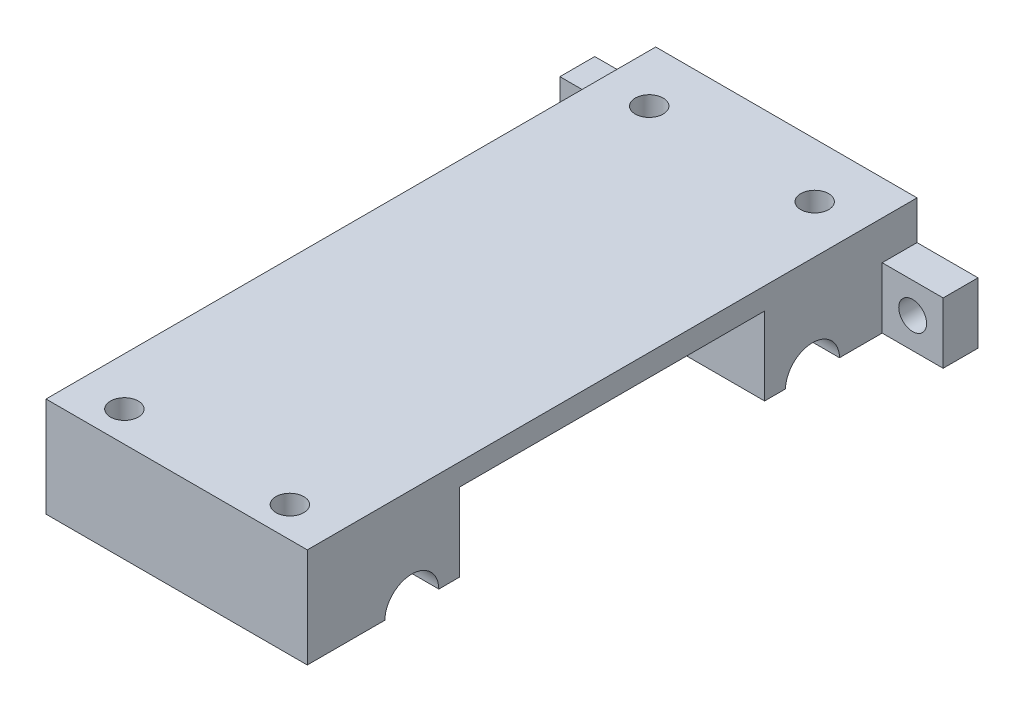
ISO-10303-21;
HEADER;
FILE_DESCRIPTION(('STEP AP214'),'2;1');
FILE_NAME('part.step','',(''),(''),'','','');
FILE_SCHEMA(('AUTOMOTIVE_DESIGN { 1 0 10303 214 1 1 1 1 }'));
ENDSEC;
DATA;
#1=APPLICATION_CONTEXT('core data for automotive mechanical design processes');
#2=APPLICATION_PROTOCOL_DEFINITION('international standard','automotive_design',2000,#1);
#3=PRODUCT_CONTEXT('',#1,'mechanical');
#4=PRODUCT('Part','Part','',(#3));
#5=PRODUCT_RELATED_PRODUCT_CATEGORY('part','',(#4));
#6=PRODUCT_DEFINITION_FORMATION('','',#4);
#7=PRODUCT_DEFINITION_CONTEXT('part definition',#1,'design');
#8=PRODUCT_DEFINITION('design','',#6,#7);
#9=PRODUCT_DEFINITION_SHAPE('','',#8);
#10=(LENGTH_UNIT() NAMED_UNIT(*) SI_UNIT(.MILLI.,.METRE.));
#11=(NAMED_UNIT(*) PLANE_ANGLE_UNIT() SI_UNIT($,.RADIAN.));
#12=(NAMED_UNIT(*) SI_UNIT($,.STERADIAN.) SOLID_ANGLE_UNIT());
#13=UNCERTAINTY_MEASURE_WITH_UNIT(LENGTH_MEASURE(1.E-05),#10,'distance_accuracy_value','');
#14=(GEOMETRIC_REPRESENTATION_CONTEXT(3) GLOBAL_UNCERTAINTY_ASSIGNED_CONTEXT((#13)) GLOBAL_UNIT_ASSIGNED_CONTEXT((#10,
#11,#12)) REPRESENTATION_CONTEXT('',''));
#15=CARTESIAN_POINT('',(0.,0.,0.));
#16=DIRECTION('',(0.,0.,1.));
#17=DIRECTION('',(1.,0.,0.));
#18=AXIS2_PLACEMENT_3D('',#15,#16,#17);
#19=CARTESIAN_POINT('',(15.,-0.95,-35.));
#20=DIRECTION('',(1.,0.,0.));
#21=DIRECTION('',(0.,0.,-1.));
#22=AXIS2_PLACEMENT_3D('',#19,#20,#21);
#23=PLANE('',#22);
#24=DIRECTION('',(0.,0.,-1.));
#25=VECTOR('',#24,1.);
#26=CARTESIAN_POINT('',(15.,-0.95,-35.));
#27=LINE('',#26,#25);
#28=CARTESIAN_POINT('',(15.,-0.95,-26.0995967479658));
#29=VERTEX_POINT('',#28);
#30=CARTESIAN_POINT('',(15.,-0.95,-31.));
#31=VERTEX_POINT('',#30);
#32=EDGE_CURVE('E310',#29,#31,#27,.T.);
#33=ORIENTED_EDGE('',*,*,#32,.T.);
#34=DIRECTION('',(0.,1.,0.));
#35=VECTOR('',#34,1.);
#36=CARTESIAN_POINT('',(15.,-0.95,-31.));
#37=LINE('',#36,#35);
#38=CARTESIAN_POINT('',(15.,6.05,-31.));
#39=VERTEX_POINT('',#38);
#40=EDGE_CURVE('E207',#31,#39,#37,.T.);
#41=ORIENTED_EDGE('',*,*,#40,.T.);
#42=DIRECTION('',(0.,0.,-1.));
#43=VECTOR('',#42,1.);
#44=CARTESIAN_POINT('',(15.,6.05,-31.));
#45=LINE('',#44,#43);
#46=CARTESIAN_POINT('',(15.,6.05,-35.));
#47=VERTEX_POINT('',#46);
#48=EDGE_CURVE('E220',#39,#47,#45,.T.);
#49=ORIENTED_EDGE('',*,*,#48,.T.);
#50=DIRECTION('',(0.,1.,0.));
#51=VECTOR('',#50,1.);
#52=CARTESIAN_POINT('',(15.,-0.95,-35.));
#53=LINE('',#52,#51);
#54=CARTESIAN_POINT('',(15.,10.5,-35.));
#55=VERTEX_POINT('',#54);
#56=EDGE_CURVE('E325',#47,#55,#53,.T.);
#57=ORIENTED_EDGE('',*,*,#56,.T.);
#58=DIRECTION('',(0.,0.,-1.));
#59=VECTOR('',#58,1.);
#60=CARTESIAN_POINT('',(15.,10.5,-35.));
#61=LINE('',#60,#59);
#62=CARTESIAN_POINT('',(15.,10.5,35.));
#63=VERTEX_POINT('',#62);
#64=EDGE_CURVE('E290',#63,#55,#61,.T.);
#65=ORIENTED_EDGE('',*,*,#64,.F.);
#66=DIRECTION('',(0.,1.,0.));
#67=VECTOR('',#66,1.);
#68=CARTESIAN_POINT('',(15.,-0.95,35.));
#69=LINE('',#68,#67);
#70=CARTESIAN_POINT('',(15.,-0.95,35.));
#71=VERTEX_POINT('',#70);
#72=EDGE_CURVE('E326',#71,#63,#69,.T.);
#73=ORIENTED_EDGE('',*,*,#72,.F.);
#74=CARTESIAN_POINT('',(15.,-0.95,26.0995967479658));
#75=VERTEX_POINT('',#74);
#76=EDGE_CURVE('E311',#71,#75,#27,.T.);
#77=ORIENTED_EDGE('',*,*,#76,.T.);
#78=CARTESIAN_POINT('',(15.,-1.,23.));
#79=DIRECTION('',(-1.,0.,0.));
#80=DIRECTION('',(0.,0.,1.));
#81=AXIS2_PLACEMENT_3D('',#78,#79,#80);
#82=CIRCLE('',#81,3.1);
#83=CARTESIAN_POINT('',(15.,-0.95,19.9004032520342));
#84=VERTEX_POINT('',#83);
#85=EDGE_CURVE('E262',#75,#84,#82,.T.);
#86=ORIENTED_EDGE('',*,*,#85,.T.);
#87=CARTESIAN_POINT('',(15.,-0.95,17.5));
#88=VERTEX_POINT('',#87);
#89=EDGE_CURVE('E315',#84,#88,#27,.T.);
#90=ORIENTED_EDGE('',*,*,#89,.T.);
#91=DIRECTION('',(0.,-1.,0.));
#92=VECTOR('',#91,1.);
#93=CARTESIAN_POINT('',(15.,8.,17.5));
#94=LINE('',#93,#92);
#95=CARTESIAN_POINT('',(15.,8.,17.5));
#96=VERTEX_POINT('',#95);
#97=EDGE_CURVE('E291',#96,#88,#94,.T.);
#98=ORIENTED_EDGE('',*,*,#97,.F.);
#99=DIRECTION('',(0.,0.,1.));
#100=VECTOR('',#99,1.);
#101=CARTESIAN_POINT('',(15.,8.,-17.5));
#102=LINE('',#101,#100);
#103=CARTESIAN_POINT('',(15.,8.,-17.5));
#104=VERTEX_POINT('',#103);
#105=EDGE_CURVE('E279',#104,#96,#102,.T.);
#106=ORIENTED_EDGE('',*,*,#105,.F.);
#107=DIRECTION('',(0.,-1.,0.));
#108=VECTOR('',#107,1.);
#109=CARTESIAN_POINT('',(15.,8.,-17.5));
#110=LINE('',#109,#108);
#111=CARTESIAN_POINT('',(15.,-0.95,-17.5));
#112=VERTEX_POINT('',#111);
#113=EDGE_CURVE('E294',#104,#112,#110,.T.);
#114=ORIENTED_EDGE('',*,*,#113,.T.);
#115=CARTESIAN_POINT('',(15.,-0.95,-19.9004032520342));
#116=VERTEX_POINT('',#115);
#117=EDGE_CURVE('E316',#112,#116,#27,.T.);
#118=ORIENTED_EDGE('',*,*,#117,.T.);
#119=CARTESIAN_POINT('',(15.,-1.,-23.));
#120=DIRECTION('',(-1.,0.,0.));
#121=DIRECTION('',(0.,0.,1.));
#122=AXIS2_PLACEMENT_3D('',#119,#120,#121);
#123=CIRCLE('',#122,3.1);
#124=EDGE_CURVE('E255',#116,#29,#123,.T.);
#125=ORIENTED_EDGE('',*,*,#124,.T.);
#126=EDGE_LOOP('',(#33,#41,#49,#57,#65,#73,#77,#86,#90,#98,#106,#114,#118,#125));
#127=FACE_BOUND('',#126,.T.);
#128=ADVANCED_FACE('F44',(#127),#23,.T.);
#129=CARTESIAN_POINT('',(0.,-0.95,0.));
#130=DIRECTION('',(0.,1.,0.));
#131=DIRECTION('',(0.,0.,1.));
#132=AXIS2_PLACEMENT_3D('',#129,#130,#131);
#133=PLANE('',#132);
#134=ORIENTED_EDGE('',*,*,#89,.F.);
#135=DIRECTION('',(-1.,0.,0.));
#136=VECTOR('',#135,1.);
#137=CARTESIAN_POINT('',(15.,-0.95,19.9004032520342));
#138=LINE('',#137,#136);
#139=CARTESIAN_POINT('',(-15.,-0.95,19.9004032520342));
#140=VERTEX_POINT('',#139);
#141=EDGE_CURVE('E268',#84,#140,#138,.T.);
#142=ORIENTED_EDGE('',*,*,#141,.T.);
#143=DIRECTION('',(0.,0.,1.));
#144=VECTOR('',#143,1.);
#145=CARTESIAN_POINT('',(-15.,-0.95,-35.));
#146=LINE('',#145,#144);
#147=CARTESIAN_POINT('',(-15.,-0.95,17.5));
#148=VERTEX_POINT('',#147);
#149=EDGE_CURVE('E322',#148,#140,#146,.T.);
#150=ORIENTED_EDGE('',*,*,#149,.F.);
#151=DIRECTION('',(-1.,0.,0.));
#152=VECTOR('',#151,1.);
#153=CARTESIAN_POINT('',(15.,-0.95,17.5));
#154=LINE('',#153,#152);
#155=EDGE_CURVE('E276',#88,#148,#154,.T.);
#156=ORIENTED_EDGE('',*,*,#155,.F.);
#157=EDGE_LOOP('',(#134,#142,#150,#156));
#158=FACE_BOUND('',#157,.T.);
#159=ADVANCED_FACE('F387',(#158),#133,.F.);
#160=CARTESIAN_POINT('',(9.50000000000001,-0.95,-28.75));
#161=DIRECTION('',(0.,1.,0.));
#162=DIRECTION('',(0.,0.,1.));
#163=AXIS2_PLACEMENT_3D('',#160,#161,#162);
#164=CIRCLE('',#163,1.6);
#165=CARTESIAN_POINT('',(9.50000000000001,-0.95,-27.15));
#166=VERTEX_POINT('',#165);
#167=EDGE_CURVE('E237',#166,#166,#164,.T.);
#168=ORIENTED_EDGE('',*,*,#167,.T.);
#169=EDGE_LOOP('',(#168));
#170=FACE_BOUND('',#169,.T.);
#171=CARTESIAN_POINT('',(-9.5,-0.95,-28.75));
#172=DIRECTION('',(0.,1.,0.));
#173=DIRECTION('',(0.,0.,1.));
#174=AXIS2_PLACEMENT_3D('',#171,#172,#173);
#175=CIRCLE('',#174,1.6);
#176=CARTESIAN_POINT('',(-9.5,-0.95,-27.15));
#177=VERTEX_POINT('',#176);
#178=EDGE_CURVE('E249',#177,#177,#175,.T.);
#179=ORIENTED_EDGE('',*,*,#178,.T.);
#180=EDGE_LOOP('',(#179));
#181=FACE_BOUND('',#180,.T.);
#182=ORIENTED_EDGE('',*,*,#32,.F.);
#183=DIRECTION('',(-1.,0.,0.));
#184=VECTOR('',#183,1.);
#185=CARTESIAN_POINT('',(15.,-0.95,-26.0995967479658));
#186=LINE('',#185,#184);
#187=CARTESIAN_POINT('',(-15.,-0.95,-26.0995967479658));
#188=VERTEX_POINT('',#187);
#189=EDGE_CURVE('E13',#29,#188,#186,.T.);
#190=ORIENTED_EDGE('',*,*,#189,.T.);
#191=CARTESIAN_POINT('',(-15.,-0.95,-31.));
#192=VERTEX_POINT('',#191);
#193=EDGE_CURVE('E186',#192,#188,#146,.T.);
#194=ORIENTED_EDGE('',*,*,#193,.F.);
#195=DIRECTION('',(-1.,0.,0.));
#196=VECTOR('',#195,1.);
#197=CARTESIAN_POINT('',(-15.,-0.95,-31.));
#198=LINE('',#197,#196);
#199=CARTESIAN_POINT('',(-22.,-0.95,-31.));
#200=VERTEX_POINT('',#199);
#201=EDGE_CURVE('E58',#192,#200,#198,.T.);
#202=ORIENTED_EDGE('',*,*,#201,.T.);
#203=DIRECTION('',(0.,0.,-1.));
#204=VECTOR('',#203,1.);
#205=CARTESIAN_POINT('',(-22.,-0.95,-31.));
#206=LINE('',#205,#204);
#207=CARTESIAN_POINT('',(-22.,-0.95,-35.));
#208=VERTEX_POINT('',#207);
#209=EDGE_CURVE('E170',#200,#208,#206,.T.);
#210=ORIENTED_EDGE('',*,*,#209,.T.);
#211=DIRECTION('',(-1.,0.,0.));
#212=VECTOR('',#211,1.);
#213=CARTESIAN_POINT('',(-15.,-0.95,-35.));
#214=LINE('',#213,#212);
#215=CARTESIAN_POINT('',(22.,-0.950000000000001,-35.));
#216=VERTEX_POINT('',#215);
#217=EDGE_CURVE('E314',#216,#208,#214,.T.);
#218=ORIENTED_EDGE('',*,*,#217,.F.);
#219=DIRECTION('',(0.,0.,-1.));
#220=VECTOR('',#219,1.);
#221=CARTESIAN_POINT('',(22.,-0.950000000000001,-31.));
#222=LINE('',#221,#220);
#223=CARTESIAN_POINT('',(22.,-0.950000000000001,-31.));
#224=VERTEX_POINT('',#223);
#225=EDGE_CURVE('E224',#224,#216,#222,.T.);
#226=ORIENTED_EDGE('',*,*,#225,.F.);
#227=DIRECTION('',(-1.,0.,0.));
#228=VECTOR('',#227,1.);
#229=CARTESIAN_POINT('',(15.,-0.95,-31.));
#230=LINE('',#229,#228);
#231=EDGE_CURVE('E217',#224,#31,#230,.T.);
#232=ORIENTED_EDGE('',*,*,#231,.T.);
#233=EDGE_LOOP('',(#182,#190,#194,#202,#210,#218,#226,#232));
#234=FACE_BOUND('',#233,.T.);
#235=ADVANCED_FACE('F185',(#170,#181,#234),#133,.F.);
#236=CARTESIAN_POINT('',(-9.5,-0.95,31.5));
#237=DIRECTION('',(0.,1.,0.));
#238=DIRECTION('',(0.,0.,1.));
#239=AXIS2_PLACEMENT_3D('',#236,#237,#238);
#240=CIRCLE('',#239,1.6);
#241=CARTESIAN_POINT('',(-9.5,-0.95,33.1));
#242=VERTEX_POINT('',#241);
#243=EDGE_CURVE('E244',#242,#242,#240,.T.);
#244=ORIENTED_EDGE('',*,*,#243,.T.);
#245=EDGE_LOOP('',(#244));
#246=FACE_BOUND('',#245,.T.);
#247=CARTESIAN_POINT('',(9.50000000000001,-0.95,31.5));
#248=DIRECTION('',(0.,1.,0.));
#249=DIRECTION('',(0.,0.,1.));
#250=AXIS2_PLACEMENT_3D('',#247,#248,#249);
#251=CIRCLE('',#250,1.6);
#252=CARTESIAN_POINT('',(9.50000000000001,-0.95,33.1));
#253=VERTEX_POINT('',#252);
#254=EDGE_CURVE('E231',#253,#253,#251,.T.);
#255=ORIENTED_EDGE('',*,*,#254,.T.);
#256=EDGE_LOOP('',(#255));
#257=FACE_BOUND('',#256,.T.);
#258=CARTESIAN_POINT('',(-15.,-0.95,26.0995967479658));
#259=VERTEX_POINT('',#258);
#260=CARTESIAN_POINT('',(-15.,-0.95,35.));
#261=VERTEX_POINT('',#260);
#262=EDGE_CURVE('E318',#259,#261,#146,.T.);
#263=ORIENTED_EDGE('',*,*,#262,.F.);
#264=DIRECTION('',(-1.,0.,0.));
#265=VECTOR('',#264,1.);
#266=CARTESIAN_POINT('',(15.,-0.95,26.0995967479658));
#267=LINE('',#266,#265);
#268=EDGE_CURVE('E258',#259,#75,#267,.F.);
#269=ORIENTED_EDGE('',*,*,#268,.T.);
#270=ORIENTED_EDGE('',*,*,#76,.F.);
#271=DIRECTION('',(1.,0.,0.));
#272=VECTOR('',#271,1.);
#273=CARTESIAN_POINT('',(-15.,-0.95,35.));
#274=LINE('',#273,#272);
#275=EDGE_CURVE('E320',#261,#71,#274,.T.);
#276=ORIENTED_EDGE('',*,*,#275,.F.);
#277=EDGE_LOOP('',(#263,#269,#270,#276));
#278=FACE_BOUND('',#277,.T.);
#279=ADVANCED_FACE('F367',(#246,#257,#278),#133,.F.);
#280=CARTESIAN_POINT('',(-15.,-0.95,35.));
#281=DIRECTION('',(0.,0.,1.));
#282=DIRECTION('',(1.,0.,0.));
#283=AXIS2_PLACEMENT_3D('',#280,#281,#282);
#284=PLANE('',#283);
#285=ORIENTED_EDGE('',*,*,#72,.T.);
#286=DIRECTION('',(1.,0.,0.));
#287=VECTOR('',#286,1.);
#288=CARTESIAN_POINT('',(-15.,10.5,35.));
#289=LINE('',#288,#287);
#290=CARTESIAN_POINT('',(-15.,10.5,35.));
#291=VERTEX_POINT('',#290);
#292=EDGE_CURVE('E307',#291,#63,#289,.T.);
#293=ORIENTED_EDGE('',*,*,#292,.F.);
#294=DIRECTION('',(0.,1.,0.));
#295=VECTOR('',#294,1.);
#296=CARTESIAN_POINT('',(-15.,-0.95,35.));
#297=LINE('',#296,#295);
#298=EDGE_CURVE('E328',#261,#291,#297,.T.);
#299=ORIENTED_EDGE('',*,*,#298,.F.);
#300=ORIENTED_EDGE('',*,*,#275,.T.);
#301=EDGE_LOOP('',(#285,#293,#299,#300));
#302=FACE_BOUND('',#301,.T.);
#303=ADVANCED_FACE('F369',(#302),#284,.T.);
#304=CARTESIAN_POINT('',(-15.,-0.95,-35.));
#305=DIRECTION('',(-1.,0.,0.));
#306=DIRECTION('',(0.,0.,1.));
#307=AXIS2_PLACEMENT_3D('',#304,#305,#306);
#308=PLANE('',#307);
#309=DIRECTION('',(0.,0.,-1.));
#310=VECTOR('',#309,1.);
#311=CARTESIAN_POINT('',(-15.,6.05,-31.));
#312=LINE('',#311,#310);
#313=CARTESIAN_POINT('',(-15.,6.05,-31.));
#314=VERTEX_POINT('',#313);
#315=CARTESIAN_POINT('',(-15.,6.05,-35.));
#316=VERTEX_POINT('',#315);
#317=EDGE_CURVE('E198',#314,#316,#312,.T.);
#318=ORIENTED_EDGE('',*,*,#317,.F.);
#319=DIRECTION('',(0.,-1.,0.));
#320=VECTOR('',#319,1.);
#321=CARTESIAN_POINT('',(-15.,-0.95,-31.));
#322=LINE('',#321,#320);
#323=EDGE_CURVE('E187',#314,#192,#322,.T.);
#324=ORIENTED_EDGE('',*,*,#323,.T.);
#325=ORIENTED_EDGE('',*,*,#193,.T.);
#326=CARTESIAN_POINT('',(-15.,-1.,-23.));
#327=DIRECTION('',(-1.,0.,0.));
#328=DIRECTION('',(0.,0.,1.));
#329=AXIS2_PLACEMENT_3D('',#326,#327,#328);
#330=CIRCLE('',#329,3.1);
#331=CARTESIAN_POINT('',(-15.,-0.95,-19.9004032520342));
#332=VERTEX_POINT('',#331);
#333=EDGE_CURVE('E259',#332,#188,#330,.T.);
#334=ORIENTED_EDGE('',*,*,#333,.F.);
#335=CARTESIAN_POINT('',(-15.,-0.95,-17.5));
#336=VERTEX_POINT('',#335);
#337=EDGE_CURVE('E321',#332,#336,#146,.T.);
#338=ORIENTED_EDGE('',*,*,#337,.T.);
#339=DIRECTION('',(0.,-1.,0.));
#340=VECTOR('',#339,1.);
#341=CARTESIAN_POINT('',(-15.,8.,-17.5));
#342=LINE('',#341,#340);
#343=CARTESIAN_POINT('',(-15.,8.,-17.5));
#344=VERTEX_POINT('',#343);
#345=EDGE_CURVE('E284',#344,#336,#342,.T.);
#346=ORIENTED_EDGE('',*,*,#345,.F.);
#347=DIRECTION('',(0.,0.,-1.));
#348=VECTOR('',#347,1.);
#349=CARTESIAN_POINT('',(-15.,8.,-17.5));
#350=LINE('',#349,#348);
#351=CARTESIAN_POINT('',(-15.,8.,17.5));
#352=VERTEX_POINT('',#351);
#353=EDGE_CURVE('E272',#352,#344,#350,.T.);
#354=ORIENTED_EDGE('',*,*,#353,.F.);
#355=DIRECTION('',(0.,-1.,0.));
#356=VECTOR('',#355,1.);
#357=CARTESIAN_POINT('',(-15.,8.,17.5));
#358=LINE('',#357,#356);
#359=EDGE_CURVE('E287',#352,#148,#358,.T.);
#360=ORIENTED_EDGE('',*,*,#359,.T.);
#361=ORIENTED_EDGE('',*,*,#149,.T.);
#362=CARTESIAN_POINT('',(-15.,-1.,23.));
#363=DIRECTION('',(-1.,0.,0.));
#364=DIRECTION('',(0.,0.,1.));
#365=AXIS2_PLACEMENT_3D('',#362,#363,#364);
#366=CIRCLE('',#365,3.1);
#367=EDGE_CURVE('E252',#259,#140,#366,.T.);
#368=ORIENTED_EDGE('',*,*,#367,.F.);
#369=ORIENTED_EDGE('',*,*,#262,.T.);
#370=ORIENTED_EDGE('',*,*,#298,.T.);
#371=DIRECTION('',(0.,0.,1.));
#372=VECTOR('',#371,1.);
#373=CARTESIAN_POINT('',(-15.,10.5,-35.));
#374=LINE('',#373,#372);
#375=CARTESIAN_POINT('',(-15.,10.5,-35.));
#376=VERTEX_POINT('',#375);
#377=EDGE_CURVE('E304',#376,#291,#374,.T.);
#378=ORIENTED_EDGE('',*,*,#377,.F.);
#379=DIRECTION('',(0.,1.,0.));
#380=VECTOR('',#379,1.);
#381=CARTESIAN_POINT('',(-15.,-0.95,-35.));
#382=LINE('',#381,#380);
#383=EDGE_CURVE('E330',#316,#376,#382,.T.);
#384=ORIENTED_EDGE('',*,*,#383,.F.);
#385=EDGE_LOOP('',(#318,#324,#325,#334,#338,#346,#354,#360,#361,#368,#369,#370,#378,#384));
#386=FACE_BOUND('',#385,.T.);
#387=ADVANCED_FACE('F372',(#386),#308,.T.);
#388=CARTESIAN_POINT('',(-15.,-0.95,-35.));
#389=DIRECTION('',(0.,0.,-1.));
#390=DIRECTION('',(-1.,0.,0.));
#391=AXIS2_PLACEMENT_3D('',#388,#389,#390);
#392=PLANE('',#391);
#393=ORIENTED_EDGE('',*,*,#217,.T.);
#394=DIRECTION('',(0.,1.,0.));
#395=VECTOR('',#394,1.);
#396=CARTESIAN_POINT('',(-22.,-0.95,-35.));
#397=LINE('',#396,#395);
#398=CARTESIAN_POINT('',(-22.,6.05,-35.));
#399=VERTEX_POINT('',#398);
#400=EDGE_CURVE('E175',#208,#399,#397,.T.);
#401=ORIENTED_EDGE('',*,*,#400,.T.);
#402=DIRECTION('',(1.,0.,0.));
#403=VECTOR('',#402,1.);
#404=CARTESIAN_POINT('',(-15.,6.05,-35.));
#405=LINE('',#404,#403);
#406=EDGE_CURVE('E189',#399,#316,#405,.T.);
#407=ORIENTED_EDGE('',*,*,#406,.T.);
#408=ORIENTED_EDGE('',*,*,#383,.T.);
#409=DIRECTION('',(-1.,0.,0.));
#410=VECTOR('',#409,1.);
#411=CARTESIAN_POINT('',(-15.,10.5,-35.));
#412=LINE('',#411,#410);
#413=EDGE_CURVE('E301',#55,#376,#412,.T.);
#414=ORIENTED_EDGE('',*,*,#413,.F.);
#415=ORIENTED_EDGE('',*,*,#56,.F.);
#416=DIRECTION('',(1.,0.,0.));
#417=VECTOR('',#416,1.);
#418=CARTESIAN_POINT('',(15.,6.05,-35.));
#419=LINE('',#418,#417);
#420=CARTESIAN_POINT('',(22.,6.05,-35.));
#421=VERTEX_POINT('',#420);
#422=EDGE_CURVE('E66',#47,#421,#419,.T.);
#423=ORIENTED_EDGE('',*,*,#422,.T.);
#424=DIRECTION('',(0.,-1.,0.));
#425=VECTOR('',#424,1.);
#426=CARTESIAN_POINT('',(22.,-0.950000000000001,-35.));
#427=LINE('',#426,#425);
#428=EDGE_CURVE('E211',#421,#216,#427,.T.);
#429=ORIENTED_EDGE('',*,*,#428,.T.);
#430=EDGE_LOOP('',(#393,#401,#407,#408,#414,#415,#423,#429));
#431=FACE_BOUND('',#430,.T.);
#432=CARTESIAN_POINT('',(18.5,2.55,-35.));
#433=DIRECTION('',(0.,0.,-1.));
#434=DIRECTION('',(-1.,0.,0.));
#435=AXIS2_PLACEMENT_3D('',#432,#433,#434);
#436=CIRCLE('',#435,1.6);
#437=CARTESIAN_POINT('',(16.9,2.55,-35.));
#438=VERTEX_POINT('',#437);
#439=EDGE_CURVE('E200',#438,#438,#436,.T.);
#440=ORIENTED_EDGE('',*,*,#439,.F.);
#441=EDGE_LOOP('',(#440));
#442=FACE_BOUND('',#441,.T.);
#443=CARTESIAN_POINT('',(-18.5,2.55,-35.));
#444=DIRECTION('',(0.,0.,-1.));
#445=DIRECTION('',(-1.,0.,0.));
#446=AXIS2_PLACEMENT_3D('',#443,#444,#445);
#447=CIRCLE('',#446,1.52513021218963);
#448=CARTESIAN_POINT('',(-20.0251302121896,2.55,-35.));
#449=VERTEX_POINT('',#448);
#450=EDGE_CURVE('E644',#449,#449,#447,.T.);
#451=ORIENTED_EDGE('',*,*,#450,.F.);
#452=EDGE_LOOP('',(#451));
#453=FACE_BOUND('',#452,.T.);
#454=ADVANCED_FACE('F355',(#431,#442,#453),#392,.T.);
#455=ORIENTED_EDGE('',*,*,#337,.F.);
#456=DIRECTION('',(-1.,0.,0.));
#457=VECTOR('',#456,1.);
#458=CARTESIAN_POINT('',(15.,-0.95,-19.9004032520342));
#459=LINE('',#458,#457);
#460=EDGE_CURVE('E51',#332,#116,#459,.F.);
#461=ORIENTED_EDGE('',*,*,#460,.T.);
#462=ORIENTED_EDGE('',*,*,#117,.F.);
#463=DIRECTION('',(1.,0.,0.));
#464=VECTOR('',#463,1.);
#465=CARTESIAN_POINT('',(15.,-0.95,-17.5));
#466=LINE('',#465,#464);
#467=EDGE_CURVE('E271',#336,#112,#466,.T.);
#468=ORIENTED_EDGE('',*,*,#467,.F.);
#469=EDGE_LOOP('',(#455,#461,#462,#468));
#470=FACE_BOUND('',#469,.T.);
#471=ADVANCED_FACE('F337',(#470),#133,.F.);
#472=CARTESIAN_POINT('',(0.,10.5,0.));
#473=DIRECTION('',(0.,1.,0.));
#474=DIRECTION('',(0.,0.,1.));
#475=AXIS2_PLACEMENT_3D('',#472,#473,#474);
#476=PLANE('',#475);
#477=CARTESIAN_POINT('',(9.50000000000001,10.5,-28.75));
#478=DIRECTION('',(0.,1.,0.));
#479=DIRECTION('',(0.,0.,1.));
#480=AXIS2_PLACEMENT_3D('',#477,#478,#479);
#481=CIRCLE('',#480,1.6);
#482=CARTESIAN_POINT('',(9.50000000000001,10.5,-27.15));
#483=VERTEX_POINT('',#482);
#484=EDGE_CURVE('E241',#483,#483,#481,.T.);
#485=ORIENTED_EDGE('',*,*,#484,.F.);
#486=EDGE_LOOP('',(#485));
#487=FACE_BOUND('',#486,.T.);
#488=CARTESIAN_POINT('',(-9.5,10.5,31.5));
#489=DIRECTION('',(0.,1.,0.));
#490=DIRECTION('',(0.,0.,1.));
#491=AXIS2_PLACEMENT_3D('',#488,#489,#490);
#492=CIRCLE('',#491,1.6);
#493=CARTESIAN_POINT('',(-9.5,10.5,33.1));
#494=VERTEX_POINT('',#493);
#495=EDGE_CURVE('E234',#494,#494,#492,.T.);
#496=ORIENTED_EDGE('',*,*,#495,.F.);
#497=EDGE_LOOP('',(#496));
#498=FACE_BOUND('',#497,.T.);
#499=CARTESIAN_POINT('',(9.50000000000001,10.5,31.5));
#500=DIRECTION('',(0.,1.,0.));
#501=DIRECTION('',(0.,0.,1.));
#502=AXIS2_PLACEMENT_3D('',#499,#500,#501);
#503=CIRCLE('',#502,1.6);
#504=CARTESIAN_POINT('',(9.50000000000001,10.5,33.1));
#505=VERTEX_POINT('',#504);
#506=EDGE_CURVE('E227',#505,#505,#503,.T.);
#507=ORIENTED_EDGE('',*,*,#506,.F.);
#508=EDGE_LOOP('',(#507));
#509=FACE_BOUND('',#508,.T.);
#510=CARTESIAN_POINT('',(-9.5,10.5,-28.75));
#511=DIRECTION('',(0.,1.,0.));
#512=DIRECTION('',(0.,0.,1.));
#513=AXIS2_PLACEMENT_3D('',#510,#511,#512);
#514=CIRCLE('',#513,1.6);
#515=CARTESIAN_POINT('',(-9.5,10.5,-27.15));
#516=VERTEX_POINT('',#515);
#517=EDGE_CURVE('E240',#516,#516,#514,.T.);
#518=ORIENTED_EDGE('',*,*,#517,.F.);
#519=EDGE_LOOP('',(#518));
#520=FACE_BOUND('',#519,.T.);
#521=ORIENTED_EDGE('',*,*,#64,.T.);
#522=ORIENTED_EDGE('',*,*,#413,.T.);
#523=ORIENTED_EDGE('',*,*,#377,.T.);
#524=ORIENTED_EDGE('',*,*,#292,.T.);
#525=EDGE_LOOP('',(#521,#522,#523,#524));
#526=FACE_BOUND('',#525,.T.);
#527=ADVANCED_FACE('F360',(#487,#498,#509,#520,#526),#476,.T.);
#528=CARTESIAN_POINT('',(15.,8.,17.5));
#529=DIRECTION('',(0.,0.,1.));
#530=DIRECTION('',(1.,0.,0.));
#531=AXIS2_PLACEMENT_3D('',#528,#529,#530);
#532=PLANE('',#531);
#533=ORIENTED_EDGE('',*,*,#155,.T.);
#534=ORIENTED_EDGE('',*,*,#359,.F.);
#535=DIRECTION('',(-1.,0.,0.));
#536=VECTOR('',#535,1.);
#537=CARTESIAN_POINT('',(15.,8.,17.5));
#538=LINE('',#537,#536);
#539=EDGE_CURVE('E281',#96,#352,#538,.T.);
#540=ORIENTED_EDGE('',*,*,#539,.F.);
#541=ORIENTED_EDGE('',*,*,#97,.T.);
#542=EDGE_LOOP('',(#533,#534,#540,#541));
#543=FACE_BOUND('',#542,.T.);
#544=ADVANCED_FACE('F391',(#543),#532,.F.);
#545=CARTESIAN_POINT('',(15.,8.,-17.5));
#546=DIRECTION('',(0.,0.,-1.));
#547=DIRECTION('',(-1.,0.,0.));
#548=AXIS2_PLACEMENT_3D('',#545,#546,#547);
#549=PLANE('',#548);
#550=ORIENTED_EDGE('',*,*,#467,.T.);
#551=ORIENTED_EDGE('',*,*,#113,.F.);
#552=DIRECTION('',(1.,0.,0.));
#553=VECTOR('',#552,1.);
#554=CARTESIAN_POINT('',(15.,8.,-17.5));
#555=LINE('',#554,#553);
#556=EDGE_CURVE('E275',#344,#104,#555,.T.);
#557=ORIENTED_EDGE('',*,*,#556,.F.);
#558=ORIENTED_EDGE('',*,*,#345,.T.);
#559=EDGE_LOOP('',(#550,#551,#557,#558));
#560=FACE_BOUND('',#559,.T.);
#561=ADVANCED_FACE('F378',(#560),#549,.F.);
#562=CARTESIAN_POINT('',(0.,8.,0.));
#563=DIRECTION('',(0.,-1.,0.));
#564=DIRECTION('',(0.,0.,-1.));
#565=AXIS2_PLACEMENT_3D('',#562,#563,#564);
#566=PLANE('',#565);
#567=ORIENTED_EDGE('',*,*,#353,.T.);
#568=ORIENTED_EDGE('',*,*,#556,.T.);
#569=ORIENTED_EDGE('',*,*,#105,.T.);
#570=ORIENTED_EDGE('',*,*,#539,.T.);
#571=EDGE_LOOP('',(#567,#568,#569,#570));
#572=FACE_BOUND('',#571,.T.);
#573=ADVANCED_FACE('F380',(#572),#566,.T.);
#574=CARTESIAN_POINT('',(15.,-1.,-23.));
#575=DIRECTION('',(-1.,0.,0.));
#576=DIRECTION('',(0.,0.,1.));
#577=AXIS2_PLACEMENT_3D('',#574,#575,#576);
#578=CYLINDRICAL_SURFACE('',#577,3.1);
#579=ORIENTED_EDGE('',*,*,#124,.F.);
#580=ORIENTED_EDGE('',*,*,#460,.F.);
#581=ORIENTED_EDGE('',*,*,#333,.T.);
#582=ORIENTED_EDGE('',*,*,#189,.F.);
#583=EDGE_LOOP('',(#579,#580,#581,#582));
#584=FACE_BOUND('',#583,.T.);
#585=ADVANCED_FACE('F445',(#584),#578,.F.);
#586=CARTESIAN_POINT('',(15.,-1.,23.));
#587=DIRECTION('',(-1.,0.,0.));
#588=DIRECTION('',(0.,0.,1.));
#589=AXIS2_PLACEMENT_3D('',#586,#587,#588);
#590=CYLINDRICAL_SURFACE('',#589,3.1);
#591=ORIENTED_EDGE('',*,*,#85,.F.);
#592=ORIENTED_EDGE('',*,*,#268,.F.);
#593=ORIENTED_EDGE('',*,*,#367,.T.);
#594=ORIENTED_EDGE('',*,*,#141,.F.);
#595=EDGE_LOOP('',(#591,#592,#593,#594));
#596=FACE_BOUND('',#595,.T.);
#597=ADVANCED_FACE('F389',(#596),#590,.F.);
#598=CARTESIAN_POINT('',(-9.5,-0.95,-28.75));
#599=DIRECTION('',(0.,1.,0.));
#600=DIRECTION('',(0.,0.,1.));
#601=AXIS2_PLACEMENT_3D('',#598,#599,#600);
#602=CYLINDRICAL_SURFACE('',#601,1.6);
#603=ORIENTED_EDGE('',*,*,#178,.F.);
#604=EDGE_LOOP('',(#603));
#605=FACE_BOUND('',#604,.T.);
#606=ORIENTED_EDGE('',*,*,#517,.T.);
#607=EDGE_LOOP('',(#606));
#608=FACE_BOUND('',#607,.T.);
#609=ADVANCED_FACE('F432',(#605,#608),#602,.F.);
#610=CARTESIAN_POINT('',(9.50000000000001,-0.95,31.5));
#611=DIRECTION('',(0.,1.,0.));
#612=DIRECTION('',(0.,0.,1.));
#613=AXIS2_PLACEMENT_3D('',#610,#611,#612);
#614=CYLINDRICAL_SURFACE('',#613,1.6);
#615=ORIENTED_EDGE('',*,*,#254,.F.);
#616=EDGE_LOOP('',(#615));
#617=FACE_BOUND('',#616,.T.);
#618=ORIENTED_EDGE('',*,*,#506,.T.);
#619=EDGE_LOOP('',(#618));
#620=FACE_BOUND('',#619,.T.);
#621=ADVANCED_FACE('F428',(#617,#620),#614,.F.);
#622=CARTESIAN_POINT('',(-9.5,-0.95,31.5));
#623=DIRECTION('',(0.,1.,0.));
#624=DIRECTION('',(0.,0.,1.));
#625=AXIS2_PLACEMENT_3D('',#622,#623,#624);
#626=CYLINDRICAL_SURFACE('',#625,1.6);
#627=ORIENTED_EDGE('',*,*,#243,.F.);
#628=EDGE_LOOP('',(#627));
#629=FACE_BOUND('',#628,.T.);
#630=ORIENTED_EDGE('',*,*,#495,.T.);
#631=EDGE_LOOP('',(#630));
#632=FACE_BOUND('',#631,.T.);
#633=ADVANCED_FACE('F431',(#629,#632),#626,.F.);
#634=CARTESIAN_POINT('',(9.50000000000001,-0.95,-28.75));
#635=DIRECTION('',(0.,1.,0.));
#636=DIRECTION('',(0.,0.,1.));
#637=AXIS2_PLACEMENT_3D('',#634,#635,#636);
#638=CYLINDRICAL_SURFACE('',#637,1.6);
#639=ORIENTED_EDGE('',*,*,#167,.F.);
#640=EDGE_LOOP('',(#639));
#641=FACE_BOUND('',#640,.T.);
#642=ORIENTED_EDGE('',*,*,#484,.T.);
#643=EDGE_LOOP('',(#642));
#644=FACE_BOUND('',#643,.T.);
#645=ADVANCED_FACE('F495',(#641,#644),#638,.F.);
#646=CARTESIAN_POINT('',(22.,-0.950000000000001,-31.));
#647=DIRECTION('',(1.,0.,0.));
#648=DIRECTION('',(0.,0.,-1.));
#649=AXIS2_PLACEMENT_3D('',#646,#647,#648);
#650=PLANE('',#649);
#651=ORIENTED_EDGE('',*,*,#428,.F.);
#652=DIRECTION('',(0.,0.,-1.));
#653=VECTOR('',#652,1.);
#654=CARTESIAN_POINT('',(22.,6.05,-31.));
#655=LINE('',#654,#653);
#656=CARTESIAN_POINT('',(22.,6.05,-31.));
#657=VERTEX_POINT('',#656);
#658=EDGE_CURVE('E228',#657,#421,#655,.T.);
#659=ORIENTED_EDGE('',*,*,#658,.F.);
#660=DIRECTION('',(0.,-1.,0.));
#661=VECTOR('',#660,1.);
#662=CARTESIAN_POINT('',(22.,-0.950000000000001,-31.));
#663=LINE('',#662,#661);
#664=EDGE_CURVE('E214',#657,#224,#663,.T.);
#665=ORIENTED_EDGE('',*,*,#664,.T.);
#666=ORIENTED_EDGE('',*,*,#225,.T.);
#667=EDGE_LOOP('',(#651,#659,#665,#666));
#668=FACE_BOUND('',#667,.T.);
#669=ADVANCED_FACE('F503',(#668),#650,.T.);
#670=CARTESIAN_POINT('',(15.,6.05,-31.));
#671=DIRECTION('',(0.,1.,0.));
#672=DIRECTION('',(-1.,0.,0.));
#673=AXIS2_PLACEMENT_3D('',#670,#671,#672);
#674=PLANE('',#673);
#675=ORIENTED_EDGE('',*,*,#422,.F.);
#676=ORIENTED_EDGE('',*,*,#48,.F.);
#677=DIRECTION('',(1.,0.,0.));
#678=VECTOR('',#677,1.);
#679=CARTESIAN_POINT('',(15.,6.05,-31.));
#680=LINE('',#679,#678);
#681=EDGE_CURVE('E210',#39,#657,#680,.T.);
#682=ORIENTED_EDGE('',*,*,#681,.T.);
#683=ORIENTED_EDGE('',*,*,#658,.T.);
#684=EDGE_LOOP('',(#675,#676,#682,#683));
#685=FACE_BOUND('',#684,.T.);
#686=ADVANCED_FACE('F349',(#685),#674,.T.);
#687=CARTESIAN_POINT('',(0.,0.,-31.));
#688=DIRECTION('',(0.,0.,-1.));
#689=DIRECTION('',(-1.,0.,0.));
#690=AXIS2_PLACEMENT_3D('',#687,#688,#689);
#691=PLANE('',#690);
#692=CARTESIAN_POINT('',(18.5,2.55,-31.));
#693=DIRECTION('',(0.,0.,-1.));
#694=DIRECTION('',(-1.,0.,0.));
#695=AXIS2_PLACEMENT_3D('',#692,#693,#694);
#696=CIRCLE('',#695,1.6);
#697=CARTESIAN_POINT('',(16.9,2.55,-31.));
#698=VERTEX_POINT('',#697);
#699=EDGE_CURVE('E202',#698,#698,#696,.T.);
#700=ORIENTED_EDGE('',*,*,#699,.T.);
#701=EDGE_LOOP('',(#700));
#702=FACE_BOUND('',#701,.T.);
#703=ORIENTED_EDGE('',*,*,#40,.F.);
#704=ORIENTED_EDGE('',*,*,#231,.F.);
#705=ORIENTED_EDGE('',*,*,#664,.F.);
#706=ORIENTED_EDGE('',*,*,#681,.F.);
#707=EDGE_LOOP('',(#703,#704,#705,#706));
#708=FACE_BOUND('',#707,.T.);
#709=ADVANCED_FACE('F347',(#702,#708),#691,.F.);
#710=CARTESIAN_POINT('',(18.5,2.55,-31.));
#711=DIRECTION('',(0.,0.,-1.));
#712=DIRECTION('',(-1.,0.,0.));
#713=AXIS2_PLACEMENT_3D('',#710,#711,#712);
#714=CYLINDRICAL_SURFACE('',#713,1.6);
#715=ORIENTED_EDGE('',*,*,#699,.F.);
#716=EDGE_LOOP('',(#715));
#717=FACE_BOUND('',#716,.T.);
#718=ORIENTED_EDGE('',*,*,#439,.T.);
#719=EDGE_LOOP('',(#718));
#720=FACE_BOUND('',#719,.T.);
#721=ADVANCED_FACE('F538',(#717,#720),#714,.F.);
#722=CARTESIAN_POINT('',(-15.,6.05,-31.));
#723=DIRECTION('',(0.,1.,0.));
#724=DIRECTION('',(0.,0.,1.));
#725=AXIS2_PLACEMENT_3D('',#722,#723,#724);
#726=PLANE('',#725);
#727=ORIENTED_EDGE('',*,*,#406,.F.);
#728=DIRECTION('',(0.,0.,-1.));
#729=VECTOR('',#728,1.);
#730=CARTESIAN_POINT('',(-22.,6.05,-31.));
#731=LINE('',#730,#729);
#732=CARTESIAN_POINT('',(-22.,6.05,-31.));
#733=VERTEX_POINT('',#732);
#734=EDGE_CURVE('E177',#733,#399,#731,.T.);
#735=ORIENTED_EDGE('',*,*,#734,.F.);
#736=DIRECTION('',(1.,0.,0.));
#737=VECTOR('',#736,1.);
#738=CARTESIAN_POINT('',(-15.,6.05,-31.));
#739=LINE('',#738,#737);
#740=EDGE_CURVE('E178',#733,#314,#739,.T.);
#741=ORIENTED_EDGE('',*,*,#740,.T.);
#742=ORIENTED_EDGE('',*,*,#317,.T.);
#743=EDGE_LOOP('',(#727,#735,#741,#742));
#744=FACE_BOUND('',#743,.T.);
#745=ADVANCED_FACE('F546',(#744),#726,.T.);
#746=CARTESIAN_POINT('',(-22.,-0.95,-31.));
#747=DIRECTION('',(-1.,0.,0.));
#748=DIRECTION('',(0.,0.,1.));
#749=AXIS2_PLACEMENT_3D('',#746,#747,#748);
#750=PLANE('',#749);
#751=ORIENTED_EDGE('',*,*,#400,.F.);
#752=ORIENTED_EDGE('',*,*,#209,.F.);
#753=DIRECTION('',(0.,1.,0.));
#754=VECTOR('',#753,1.);
#755=CARTESIAN_POINT('',(-22.,-0.95,-31.));
#756=LINE('',#755,#754);
#757=EDGE_CURVE('E172',#200,#733,#756,.T.);
#758=ORIENTED_EDGE('',*,*,#757,.T.);
#759=ORIENTED_EDGE('',*,*,#734,.T.);
#760=EDGE_LOOP('',(#751,#752,#758,#759));
#761=FACE_BOUND('',#760,.T.);
#762=ADVANCED_FACE('F171',(#761),#750,.T.);
#763=CARTESIAN_POINT('',(0.,0.,-31.));
#764=DIRECTION('',(0.,0.,1.));
#765=DIRECTION('',(1.,0.,0.));
#766=AXIS2_PLACEMENT_3D('',#763,#764,#765);
#767=PLANE('',#766);
#768=CARTESIAN_POINT('',(-18.5,2.55,-31.));
#769=DIRECTION('',(0.,0.,-1.));
#770=DIRECTION('',(-1.,0.,0.));
#771=AXIS2_PLACEMENT_3D('',#768,#769,#770);
#772=CIRCLE('',#771,1.52513021218963);
#773=CARTESIAN_POINT('',(-20.0251302121896,2.55,-31.));
#774=VERTEX_POINT('',#773);
#775=EDGE_CURVE('E195',#774,#774,#772,.T.);
#776=ORIENTED_EDGE('',*,*,#775,.T.);
#777=EDGE_LOOP('',(#776));
#778=FACE_BOUND('',#777,.T.);
#779=ORIENTED_EDGE('',*,*,#323,.F.);
#780=ORIENTED_EDGE('',*,*,#740,.F.);
#781=ORIENTED_EDGE('',*,*,#757,.F.);
#782=ORIENTED_EDGE('',*,*,#201,.F.);
#783=EDGE_LOOP('',(#779,#780,#781,#782));
#784=FACE_BOUND('',#783,.T.);
#785=ADVANCED_FACE('F180',(#778,#784),#767,.T.);
#786=CARTESIAN_POINT('',(-18.5,2.55,-31.));
#787=DIRECTION('',(0.,0.,-1.));
#788=DIRECTION('',(-1.,0.,0.));
#789=AXIS2_PLACEMENT_3D('',#786,#787,#788);
#790=CYLINDRICAL_SURFACE('',#789,1.52513021218963);
#791=ORIENTED_EDGE('',*,*,#775,.F.);
#792=EDGE_LOOP('',(#791));
#793=FACE_BOUND('',#792,.T.);
#794=ORIENTED_EDGE('',*,*,#450,.T.);
#795=EDGE_LOOP('',(#794));
#796=FACE_BOUND('',#795,.T.);
#797=ADVANCED_FACE('F567',(#793,#796),#790,.F.);
#798=CLOSED_SHELL('',(#128,#159,#235,#279,#303,#387,#454,#471,#527,#544,#561,#573,#585,#597,
#609,#621,#633,#645,#669,#686,#709,#721,#745,#762,#785,#797));
#799=MANIFOLD_SOLID_BREP('B2',#798);
#800=ADVANCED_BREP_SHAPE_REPRESENTATION('',(#18,#799),#14);
#801=SHAPE_DEFINITION_REPRESENTATION(#9,#800);
ENDSEC;
END-ISO-10303-21;
